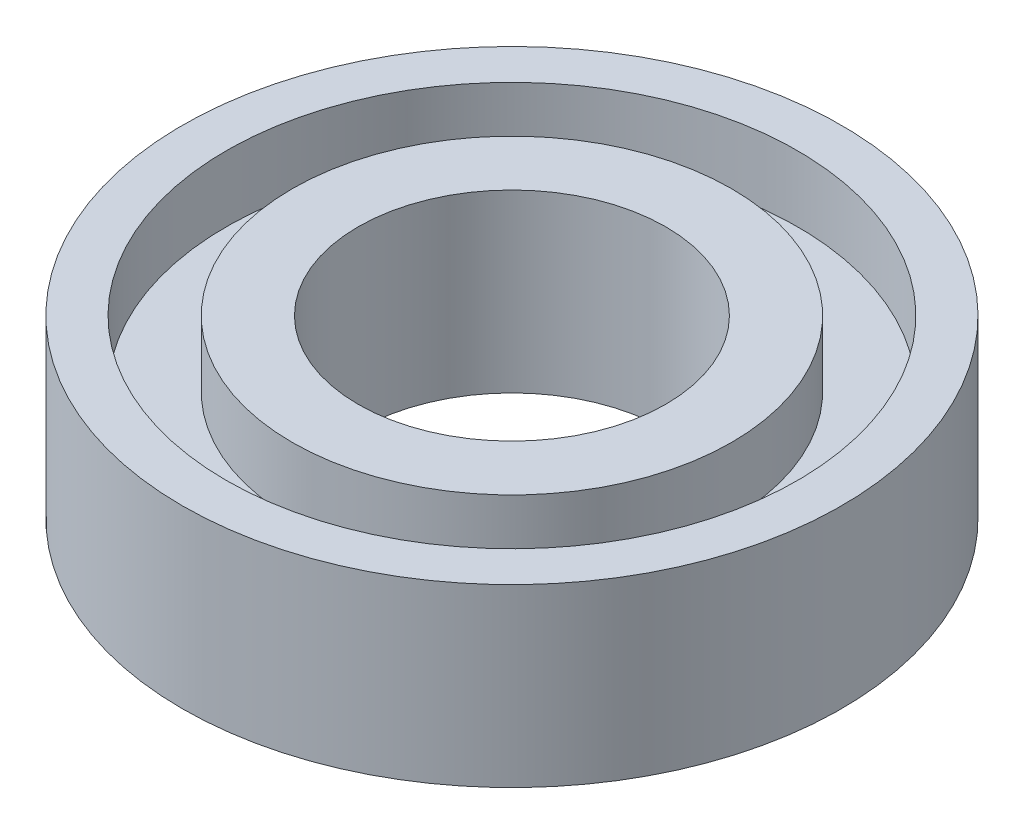
ISO-10303-21;
HEADER;
FILE_DESCRIPTION(('STEP AP214'),'2;1');
FILE_NAME('part.step','',(''),(''),'','','');
FILE_SCHEMA(('AUTOMOTIVE_DESIGN { 1 0 10303 214 1 1 1 1 }'));
ENDSEC;
DATA;
#1=APPLICATION_CONTEXT('core data for automotive mechanical design processes');
#2=APPLICATION_PROTOCOL_DEFINITION('international standard','automotive_design',2000,#1);
#3=PRODUCT_CONTEXT('',#1,'mechanical');
#4=PRODUCT('Part','Part','',(#3));
#5=PRODUCT_RELATED_PRODUCT_CATEGORY('part','',(#4));
#6=PRODUCT_DEFINITION_FORMATION('','',#4);
#7=PRODUCT_DEFINITION_CONTEXT('part definition',#1,'design');
#8=PRODUCT_DEFINITION('design','',#6,#7);
#9=PRODUCT_DEFINITION_SHAPE('','',#8);
#10=(LENGTH_UNIT() NAMED_UNIT(*) SI_UNIT(.MILLI.,.METRE.));
#11=(NAMED_UNIT(*) PLANE_ANGLE_UNIT() SI_UNIT($,.RADIAN.));
#12=(NAMED_UNIT(*) SI_UNIT($,.STERADIAN.) SOLID_ANGLE_UNIT());
#13=UNCERTAINTY_MEASURE_WITH_UNIT(LENGTH_MEASURE(1.E-05),#10,'distance_accuracy_value','');
#14=(GEOMETRIC_REPRESENTATION_CONTEXT(3) GLOBAL_UNCERTAINTY_ASSIGNED_CONTEXT((#13)) GLOBAL_UNIT_ASSIGNED_CONTEXT((#10,
#11,#12)) REPRESENTATION_CONTEXT('',''));
#15=CARTESIAN_POINT('',(0.,0.,0.));
#16=DIRECTION('',(0.,0.,1.));
#17=DIRECTION('',(1.,0.,0.));
#18=AXIS2_PLACEMENT_3D('',#15,#16,#17);
#19=CARTESIAN_POINT('',(0.,8.,0.));
#20=DIRECTION('',(0.,1.,0.));
#21=DIRECTION('',(0.,0.,1.));
#22=AXIS2_PLACEMENT_3D('',#19,#20,#21);
#23=PLANE('',#22);
#24=CARTESIAN_POINT('',(0.,8.,0.));
#25=DIRECTION('',(0.,1.,0.));
#26=DIRECTION('',(0.,0.,1.));
#27=AXIS2_PLACEMENT_3D('',#24,#25,#26);
#28=CIRCLE('',#27,7.);
#29=CARTESIAN_POINT('',(0.,8.,7.));
#30=VERTEX_POINT('',#29);
#31=EDGE_CURVE('E52',#30,#30,#28,.T.);
#32=ORIENTED_EDGE('',*,*,#31,.F.);
#33=EDGE_LOOP('',(#32));
#34=FACE_BOUND('',#33,.T.);
#35=CARTESIAN_POINT('',(0.,8.,0.));
#36=DIRECTION('',(0.,1.,0.));
#37=DIRECTION('',(0.,0.,1.));
#38=AXIS2_PLACEMENT_3D('',#35,#36,#37);
#39=CIRCLE('',#38,10.);
#40=CARTESIAN_POINT('',(0.,8.,10.));
#41=VERTEX_POINT('',#40);
#42=EDGE_CURVE('E66',#41,#41,#39,.T.);
#43=ORIENTED_EDGE('',*,*,#42,.T.);
#44=EDGE_LOOP('',(#43));
#45=FACE_BOUND('',#44,.T.);
#46=ADVANCED_FACE('F41',(#34,#45),#23,.T.);
#47=CARTESIAN_POINT('',(0.,8.,0.));
#48=DIRECTION('',(0.,1.,0.));
#49=DIRECTION('',(0.,0.,1.));
#50=AXIS2_PLACEMENT_3D('',#47,#48,#49);
#51=CIRCLE('',#50,13.);
#52=CARTESIAN_POINT('',(0.,8.,13.));
#53=VERTEX_POINT('',#52);
#54=EDGE_CURVE('E60',#53,#53,#51,.T.);
#55=ORIENTED_EDGE('',*,*,#54,.F.);
#56=EDGE_LOOP('',(#55));
#57=FACE_BOUND('',#56,.T.);
#58=CARTESIAN_POINT('',(0.,8.,0.));
#59=DIRECTION('',(0.,1.,0.));
#60=DIRECTION('',(0.,0.,1.));
#61=AXIS2_PLACEMENT_3D('',#58,#59,#60);
#62=CIRCLE('',#61,15.);
#63=CARTESIAN_POINT('',(0.,8.,15.));
#64=VERTEX_POINT('',#63);
#65=EDGE_CURVE('E10',#64,#64,#62,.T.);
#66=ORIENTED_EDGE('',*,*,#65,.T.);
#67=EDGE_LOOP('',(#66));
#68=FACE_BOUND('',#67,.T.);
#69=ADVANCED_FACE('F88',(#57,#68),#23,.T.);
#70=CARTESIAN_POINT('',(0.,0.,0.));
#71=DIRECTION('',(0.,1.,0.));
#72=DIRECTION('',(0.,0.,1.));
#73=AXIS2_PLACEMENT_3D('',#70,#71,#72);
#74=PLANE('',#73);
#75=CARTESIAN_POINT('',(0.,0.,0.));
#76=DIRECTION('',(0.,1.,0.));
#77=DIRECTION('',(0.,0.,1.));
#78=AXIS2_PLACEMENT_3D('',#75,#76,#77);
#79=CIRCLE('',#78,15.);
#80=CARTESIAN_POINT('',(0.,0.,15.));
#81=VERTEX_POINT('',#80);
#82=EDGE_CURVE('E45',#81,#81,#79,.T.);
#83=ORIENTED_EDGE('',*,*,#82,.F.);
#84=EDGE_LOOP('',(#83));
#85=FACE_BOUND('',#84,.T.);
#86=CARTESIAN_POINT('',(0.,0.,0.));
#87=DIRECTION('',(0.,1.,0.));
#88=DIRECTION('',(0.,0.,1.));
#89=AXIS2_PLACEMENT_3D('',#86,#87,#88);
#90=CIRCLE('',#89,7.);
#91=CARTESIAN_POINT('',(0.,0.,7.));
#92=VERTEX_POINT('',#91);
#93=EDGE_CURVE('E54',#92,#92,#90,.T.);
#94=ORIENTED_EDGE('',*,*,#93,.T.);
#95=EDGE_LOOP('',(#94));
#96=FACE_BOUND('',#95,.T.);
#97=ADVANCED_FACE('F90',(#85,#96),#74,.F.);
#98=CARTESIAN_POINT('',(0.,8.,0.));
#99=DIRECTION('',(0.,-1.,0.));
#100=DIRECTION('',(0.,0.,-1.));
#101=AXIS2_PLACEMENT_3D('',#98,#99,#100);
#102=CYLINDRICAL_SURFACE('',#101,15.);
#103=ORIENTED_EDGE('',*,*,#65,.F.);
#104=EDGE_LOOP('',(#103));
#105=FACE_BOUND('',#104,.T.);
#106=ORIENTED_EDGE('',*,*,#82,.T.);
#107=EDGE_LOOP('',(#106));
#108=FACE_BOUND('',#107,.T.);
#109=ADVANCED_FACE('F43',(#105,#108),#102,.T.);
#110=CARTESIAN_POINT('',(0.,8.,0.));
#111=DIRECTION('',(0.,-1.,0.));
#112=DIRECTION('',(0.,0.,-1.));
#113=AXIS2_PLACEMENT_3D('',#110,#111,#112);
#114=CYLINDRICAL_SURFACE('',#113,7.);
#115=ORIENTED_EDGE('',*,*,#31,.T.);
#116=EDGE_LOOP('',(#115));
#117=FACE_BOUND('',#116,.T.);
#118=ORIENTED_EDGE('',*,*,#93,.F.);
#119=EDGE_LOOP('',(#118));
#120=FACE_BOUND('',#119,.T.);
#121=ADVANCED_FACE('F84',(#117,#120),#114,.F.);
#122=CARTESIAN_POINT('',(0.,5.,0.));
#123=DIRECTION('',(0.,1.,0.));
#124=DIRECTION('',(0.,0.,1.));
#125=AXIS2_PLACEMENT_3D('',#122,#123,#124);
#126=CYLINDRICAL_SURFACE('',#125,13.);
#127=CARTESIAN_POINT('',(0.,5.,0.));
#128=DIRECTION('',(0.,1.,0.));
#129=DIRECTION('',(0.,0.,1.));
#130=AXIS2_PLACEMENT_3D('',#127,#128,#129);
#131=CIRCLE('',#130,13.);
#132=CARTESIAN_POINT('',(0.,5.,13.));
#133=VERTEX_POINT('',#132);
#134=EDGE_CURVE('E57',#133,#133,#131,.T.);
#135=ORIENTED_EDGE('',*,*,#134,.F.);
#136=EDGE_LOOP('',(#135));
#137=FACE_BOUND('',#136,.T.);
#138=ORIENTED_EDGE('',*,*,#54,.T.);
#139=EDGE_LOOP('',(#138));
#140=FACE_BOUND('',#139,.T.);
#141=ADVANCED_FACE('F78',(#137,#140),#126,.F.);
#142=CARTESIAN_POINT('',(0.,5.,0.));
#143=DIRECTION('',(0.,1.,0.));
#144=DIRECTION('',(0.,0.,1.));
#145=AXIS2_PLACEMENT_3D('',#142,#143,#144);
#146=PLANE('',#145);
#147=CARTESIAN_POINT('',(0.,5.,0.));
#148=DIRECTION('',(0.,1.,0.));
#149=DIRECTION('',(0.,0.,1.));
#150=AXIS2_PLACEMENT_3D('',#147,#148,#149);
#151=CIRCLE('',#150,10.);
#152=CARTESIAN_POINT('',(0.,5.,10.));
#153=VERTEX_POINT('',#152);
#154=EDGE_CURVE('E63',#153,#153,#151,.T.);
#155=ORIENTED_EDGE('',*,*,#154,.F.);
#156=EDGE_LOOP('',(#155));
#157=FACE_BOUND('',#156,.T.);
#158=ORIENTED_EDGE('',*,*,#134,.T.);
#159=EDGE_LOOP('',(#158));
#160=FACE_BOUND('',#159,.T.);
#161=ADVANCED_FACE('F75',(#157,#160),#146,.T.);
#162=CARTESIAN_POINT('',(0.,5.,0.));
#163=DIRECTION('',(0.,1.,0.));
#164=DIRECTION('',(0.,0.,1.));
#165=AXIS2_PLACEMENT_3D('',#162,#163,#164);
#166=CYLINDRICAL_SURFACE('',#165,10.);
#167=ORIENTED_EDGE('',*,*,#154,.T.);
#168=EDGE_LOOP('',(#167));
#169=FACE_BOUND('',#168,.T.);
#170=ORIENTED_EDGE('',*,*,#42,.F.);
#171=EDGE_LOOP('',(#170));
#172=FACE_BOUND('',#171,.T.);
#173=ADVANCED_FACE('F72',(#169,#172),#166,.T.);
#174=CLOSED_SHELL('',(#46,#69,#97,#109,#121,#141,#161,#173));
#175=MANIFOLD_SOLID_BREP('B2',#174);
#176=ADVANCED_BREP_SHAPE_REPRESENTATION('',(#18,#175),#14);
#177=SHAPE_DEFINITION_REPRESENTATION(#9,#176);
ENDSEC;
END-ISO-10303-21;
